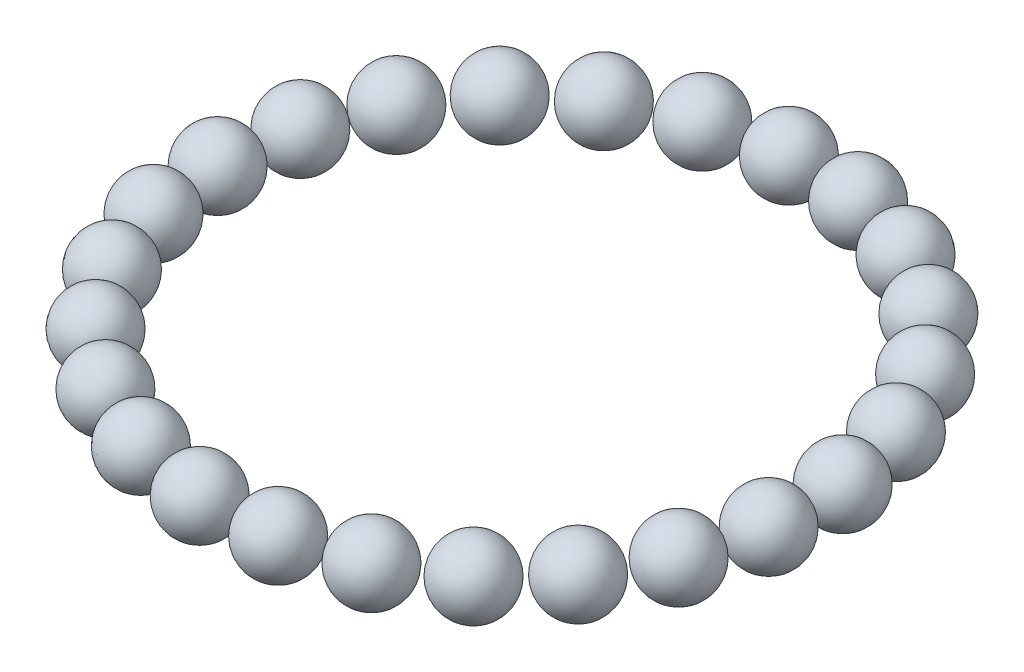
ISO-10303-21;
HEADER;
FILE_DESCRIPTION(('STEP AP214'),'2;1');
FILE_NAME('part.step','',(''),(''),'','','');
FILE_SCHEMA(('AUTOMOTIVE_DESIGN { 1 0 10303 214 1 1 1 1 }'));
ENDSEC;
DATA;
#1=APPLICATION_CONTEXT('core data for automotive mechanical design processes');
#2=APPLICATION_PROTOCOL_DEFINITION('international standard','automotive_design',2000,#1);
#3=PRODUCT_CONTEXT('',#1,'mechanical');
#4=PRODUCT('Part','Part','',(#3));
#5=PRODUCT_RELATED_PRODUCT_CATEGORY('part','',(#4));
#6=PRODUCT_DEFINITION_FORMATION('','',#4);
#7=PRODUCT_DEFINITION_CONTEXT('part definition',#1,'design');
#8=PRODUCT_DEFINITION('design','',#6,#7);
#9=PRODUCT_DEFINITION_SHAPE('','',#8);
#10=(LENGTH_UNIT() NAMED_UNIT(*) SI_UNIT(.MILLI.,.METRE.));
#11=(NAMED_UNIT(*) PLANE_ANGLE_UNIT() SI_UNIT($,.RADIAN.));
#12=(NAMED_UNIT(*) SI_UNIT($,.STERADIAN.) SOLID_ANGLE_UNIT());
#13=UNCERTAINTY_MEASURE_WITH_UNIT(LENGTH_MEASURE(1.E-05),#10,'distance_accuracy_value','');
#14=(GEOMETRIC_REPRESENTATION_CONTEXT(3) GLOBAL_UNCERTAINTY_ASSIGNED_CONTEXT((#13)) GLOBAL_UNIT_ASSIGNED_CONTEXT((#10,
#11,#12)) REPRESENTATION_CONTEXT('',''));
#15=CARTESIAN_POINT('',(0.,0.,0.));
#16=DIRECTION('',(0.,0.,1.));
#17=DIRECTION('',(1.,0.,0.));
#18=AXIS2_PLACEMENT_3D('',#15,#16,#17);
#19=CARTESIAN_POINT('',(-29.2695194201453,0.,-16.091054468671));
#20=DIRECTION('',(0.,1.,0.));
#21=DIRECTION('',(-0.87630668004387,0.,-0.481753674101704));
#22=AXIS2_PLACEMENT_3D('',#19,#20,#21);
#23=SPHERICAL_SURFACE('',#22,3.96875);
#24=CARTESIAN_POINT('',(-29.2695194201453,3.96875,-16.091054468671));
#25=VERTEX_POINT('',#24);
#26=VERTEX_LOOP('',#25);
#27=FACE_BOUND('',#26,.T.);
#28=ADVANCED_FACE('P0_F13',(#27),#23,.T.);
#29=CLOSED_SHELL('',(#28));
#30=MANIFOLD_SOLID_BREP('P0_B1',#29);
#31=CARTESIAN_POINT('',(33.1376231386049,0.,4.1862553342811));
#32=DIRECTION('',(0.,1.,0.));
#33=DIRECTION('',(0.992114701314479,0.,0.125333233564297));
#34=AXIS2_PLACEMENT_3D('',#31,#32,#33);
#35=SPHERICAL_SURFACE('',#34,3.96875);
#36=CARTESIAN_POINT('',(33.1376231386049,3.96875,4.1862553342811));
#37=VERTEX_POINT('',#36);
#38=VERTEX_LOOP('',#37);
#39=FACE_BOUND('',#38,.T.);
#40=ADVANCED_FACE('P1_F13',(#39),#35,.T.);
#41=CLOSED_SHELL('',(#40));
#42=MANIFOLD_SOLID_BREP('P1_B1',#41);
#43=CARTESIAN_POINT('',(-33.401,0.,0.));
#44=DIRECTION('',(0.,1.,0.));
#45=DIRECTION('',(-1.,0.,0.));
#46=AXIS2_PLACEMENT_3D('',#43,#44,#45);
#47=SPHERICAL_SURFACE('',#46,3.96875);
#48=CARTESIAN_POINT('',(-33.401,3.96875,0.));
#49=VERTEX_POINT('',#48);
#50=VERTEX_LOOP('',#49);
#51=FACE_BOUND('',#50,.T.);
#52=ADVANCED_FACE('P2_F13',(#51),#47,.T.);
#53=CLOSED_SHELL('',(#52));
#54=MANIFOLD_SOLID_BREP('P2_B1',#53);
#55=CARTESIAN_POINT('',(-32.3516461648575,0.,-8.30649092119287));
#56=DIRECTION('',(0.,1.,0.));
#57=DIRECTION('',(-0.968583161128635,0.,-0.248689887164842));
#58=AXIS2_PLACEMENT_3D('',#55,#56,#57);
#59=SPHERICAL_SURFACE('',#58,3.96875);
#60=CARTESIAN_POINT('',(-32.3516461648575,3.96875,-8.30649092119287));
#61=VERTEX_POINT('',#60);
#62=VERTEX_LOOP('',#61);
#63=FACE_BOUND('',#62,.T.);
#64=ADVANCED_FACE('P3_F13',(#63),#59,.T.);
#65=CLOSED_SHELL('',(#64));
#66=MANIFOLD_SOLID_BREP('P3_B1',#65);
#67=CARTESIAN_POINT('',(33.1376231386048,0.,-4.18625533428156));
#68=DIRECTION('',(0.,1.,0.));
#69=DIRECTION('',(0.992114701314477,0.,-0.125333233564311));
#70=AXIS2_PLACEMENT_3D('',#67,#68,#69);
#71=SPHERICAL_SURFACE('',#70,3.96875);
#72=CARTESIAN_POINT('',(33.1376231386048,3.96875,-4.18625533428156));
#73=VERTEX_POINT('',#72);
#74=VERTEX_LOOP('',#73);
#75=FACE_BOUND('',#74,.T.);
#76=ADVANCED_FACE('P4_F13',(#75),#71,.T.);
#77=CLOSED_SHELL('',(#76));
#78=MANIFOLD_SOLID_BREP('P4_B1',#77);
#79=CARTESIAN_POINT('',(-32.3516461648574,0.,8.30649092119333));
#80=DIRECTION('',(0.,1.,0.));
#81=DIRECTION('',(-0.968583161128631,0.,0.248689887164855));
#82=AXIS2_PLACEMENT_3D('',#79,#80,#81);
#83=SPHERICAL_SURFACE('',#82,3.96875);
#84=CARTESIAN_POINT('',(-32.3516461648574,3.96875,8.30649092119333));
#85=VERTEX_POINT('',#84);
#86=VERTEX_LOOP('',#85);
#87=FACE_BOUND('',#86,.T.);
#88=ADVANCED_FACE('P5_F13',(#87),#83,.T.);
#89=CLOSED_SHELL('',(#88));
#90=MANIFOLD_SOLID_BREP('P5_B1',#89);
#91=CARTESIAN_POINT('',(31.0554644051534,0.,-12.2957281842212));
#92=DIRECTION('',(0.,1.,0.));
#93=DIRECTION('',(0.929776485888248,0.,-0.368124552684685));
#94=AXIS2_PLACEMENT_3D('',#91,#92,#93);
#95=SPHERICAL_SURFACE('',#94,3.96875);
#96=CARTESIAN_POINT('',(31.0554644051534,3.96875,-12.2957281842212));
#97=VERTEX_POINT('',#96);
#98=VERTEX_LOOP('',#97);
#99=FACE_BOUND('',#98,.T.);
#100=ADVANCED_FACE('P6_F13',(#99),#95,.T.);
#101=CLOSED_SHELL('',(#100));
#102=MANIFOLD_SOLID_BREP('P6_B1',#101);
#103=CARTESIAN_POINT('',(-29.2695194201451,0.,16.0910544686714));
#104=DIRECTION('',(0.,1.,0.));
#105=DIRECTION('',(-0.876306680043863,0.,0.481753674101716));
#106=AXIS2_PLACEMENT_3D('',#103,#104,#105);
#107=SPHERICAL_SURFACE('',#106,3.96875);
#108=CARTESIAN_POINT('',(-29.2695194201451,3.96875,16.0910544686714));
#109=VERTEX_POINT('',#108);
#110=VERTEX_LOOP('',#109);
#111=FACE_BOUND('',#110,.T.);
#112=ADVANCED_FACE('P7_F13',(#111),#107,.T.);
#113=CLOSED_SHELL('',(#112));
#114=MANIFOLD_SOLID_BREP('P7_B1',#113);
#115=CARTESIAN_POINT('',(27.0219766291174,0.,-19.6326152118211));
#116=DIRECTION('',(0.,1.,0.));
#117=DIRECTION('',(0.809016994374942,0.,-0.58778525229248));
#118=AXIS2_PLACEMENT_3D('',#115,#116,#117);
#119=SPHERICAL_SURFACE('',#118,3.96875);
#120=CARTESIAN_POINT('',(27.0219766291174,3.96875,-19.6326152118211));
#121=VERTEX_POINT('',#120);
#122=VERTEX_LOOP('',#121);
#123=FACE_BOUND('',#122,.T.);
#124=ADVANCED_FACE('P8_F13',(#123),#119,.T.);
#125=CLOSED_SHELL('',(#124));
#126=MANIFOLD_SOLID_BREP('P8_B1',#125);
#127=CARTESIAN_POINT('',(-24.3482811245025,0.,22.8645578851242));
#128=DIRECTION('',(0.,1.,0.));
#129=DIRECTION('',(-0.72896862742141,0.,0.68454710592869));
#130=AXIS2_PLACEMENT_3D('',#127,#128,#129);
#131=SPHERICAL_SURFACE('',#130,3.96875);
#132=CARTESIAN_POINT('',(-24.3482811245025,3.96875,22.8645578851242));
#133=VERTEX_POINT('',#132);
#134=VERTEX_LOOP('',#133);
#135=FACE_BOUND('',#134,.T.);
#136=ADVANCED_FACE('P9_F13',(#135),#131,.T.);
#137=CLOSED_SHELL('',(#136));
#138=MANIFOLD_SOLID_BREP('P9_B1',#137);
#139=CARTESIAN_POINT('',(21.2905986815957,0.,-25.7359128219543));
#140=DIRECTION('',(0.,1.,0.));
#141=DIRECTION('',(0.637423989748683,0.,-0.770513242775795));
#142=AXIS2_PLACEMENT_3D('',#139,#140,#141);
#143=SPHERICAL_SURFACE('',#142,3.96875);
#144=CARTESIAN_POINT('',(21.2905986815957,3.96875,-25.7359128219543));
#145=VERTEX_POINT('',#144);
#146=VERTEX_LOOP('',#145);
#147=FACE_BOUND('',#146,.T.);
#148=ADVANCED_FACE('P10_F13',(#147),#143,.T.);
#149=CLOSED_SHELL('',(#148));
#150=MANIFOLD_SOLID_BREP('P10_B1',#149);
#151=CARTESIAN_POINT('',(-17.8971507790934,0.,28.2013970396928));
#152=DIRECTION('',(0.,1.,0.));
#153=DIRECTION('',(-0.535826794978995,0.,0.844327925502017));
#154=AXIS2_PLACEMENT_3D('',#151,#152,#153);
#155=SPHERICAL_SURFACE('',#154,3.96875);
#156=CARTESIAN_POINT('',(-17.8971507790934,3.96875,28.2013970396928));
#157=VERTEX_POINT('',#156);
#158=VERTEX_LOOP('',#157);
#159=FACE_BOUND('',#158,.T.);
#160=ADVANCED_FACE('P11_F13',(#159),#155,.T.);
#161=CLOSED_SHELL('',(#160));
#162=MANIFOLD_SOLID_BREP('P11_B1',#161);
#163=CARTESIAN_POINT('',(14.2214541175647,0.,-30.2221283794176));
#164=DIRECTION('',(0.,1.,0.));
#165=DIRECTION('',(0.425779291565064,0.,-0.904827052466024));
#166=AXIS2_PLACEMENT_3D('',#163,#164,#165);
#167=SPHERICAL_SURFACE('',#166,3.96875);
#168=CARTESIAN_POINT('',(14.2214541175647,3.96875,-30.2221283794176));
#169=VERTEX_POINT('',#168);
#170=VERTEX_LOOP('',#169);
#171=FACE_BOUND('',#170,.T.);
#172=ADVANCED_FACE('P12_F13',(#171),#167,.T.);
#173=CLOSED_SHELL('',(#172));
#174=MANIFOLD_SOLID_BREP('P12_B1',#173);
#175=CARTESIAN_POINT('',(-10.3214766291175,0.,31.7662387007745));
#176=DIRECTION('',(0.,1.,0.));
#177=DIRECTION('',(-0.309016994374945,0.,0.951056516295155));
#178=AXIS2_PLACEMENT_3D('',#175,#176,#177);
#179=SPHERICAL_SURFACE('',#178,3.96875);
#180=CARTESIAN_POINT('',(-10.3214766291175,3.96875,31.7662387007745));
#181=VERTEX_POINT('',#180);
#182=VERTEX_LOOP('',#181);
#183=FACE_BOUND('',#182,.T.);
#184=ADVANCED_FACE('P13_F13',(#183),#179,.T.);
#185=CLOSED_SHELL('',(#184));
#186=MANIFOLD_SOLID_BREP('P13_B1',#185);
#187=CARTESIAN_POINT('',(6.25872328847747,0.,-32.809376461589));
#188=DIRECTION('',(0.,1.,0.));
#189=DIRECTION('',(0.187381314585715,0.,-0.982287250728691));
#190=AXIS2_PLACEMENT_3D('',#187,#188,#189);
#191=SPHERICAL_SURFACE('',#190,3.96875);
#192=CARTESIAN_POINT('',(6.25872328847747,3.96875,-32.809376461589));
#193=VERTEX_POINT('',#192);
#194=VERTEX_LOOP('',#193);
#195=FACE_BOUND('',#194,.T.);
#196=ADVANCED_FACE('P14_F13',(#195),#191,.T.);
#197=CLOSED_SHELL('',(#196));
#198=MANIFOLD_SOLID_BREP('P14_B1',#197);
#199=CARTESIAN_POINT('',(-2.09726614279848,0.,33.3350907562327));
#200=DIRECTION('',(0.,1.,0.));
#201=DIRECTION('',(-0.06279051952931,0.,0.998026728428272));
#202=AXIS2_PLACEMENT_3D('',#199,#200,#201);
#203=SPHERICAL_SURFACE('',#202,3.96875);
#204=CARTESIAN_POINT('',(-2.09726614279848,3.96875,33.3350907562327));
#205=VERTEX_POINT('',#204);
#206=VERTEX_LOOP('',#205);
#207=FACE_BOUND('',#206,.T.);
#208=ADVANCED_FACE('P15_F13',(#207),#203,.T.);
#209=CLOSED_SHELL('',(#208));
#210=MANIFOLD_SOLID_BREP('P15_B1',#209);
#211=CARTESIAN_POINT('',(6.25872328847792,0.,32.8093764615889));
#212=DIRECTION('',(0.,1.,0.));
#213=DIRECTION('',(0.187381314585729,0.,0.982287250728688));
#214=AXIS2_PLACEMENT_3D('',#211,#212,#213);
#215=SPHERICAL_SURFACE('',#214,3.96875);
#216=CARTESIAN_POINT('',(6.25872328847792,3.96875,32.8093764615889));
#217=VERTEX_POINT('',#216);
#218=VERTEX_LOOP('',#217);
#219=FACE_BOUND('',#218,.T.);
#220=ADVANCED_FACE('P16_F13',(#219),#215,.T.);
#221=CLOSED_SHELL('',(#220));
#222=MANIFOLD_SOLID_BREP('P16_B1',#221);
#223=CARTESIAN_POINT('',(14.2214541175651,0.,30.2221283794174));
#224=DIRECTION('',(0.,1.,0.));
#225=DIRECTION('',(0.425779291565077,0.,0.904827052466018));
#226=AXIS2_PLACEMENT_3D('',#223,#224,#225);
#227=SPHERICAL_SURFACE('',#226,3.96875);
#228=CARTESIAN_POINT('',(14.2214541175651,3.96875,30.2221283794174));
#229=VERTEX_POINT('',#228);
#230=VERTEX_LOOP('',#229);
#231=FACE_BOUND('',#230,.T.);
#232=ADVANCED_FACE('P17_F13',(#231),#227,.T.);
#233=CLOSED_SHELL('',(#232));
#234=MANIFOLD_SOLID_BREP('P17_B1',#233);
#235=CARTESIAN_POINT('',(-2.09726614279896,0.,-33.3350907562327));
#236=DIRECTION('',(0.,1.,0.));
#237=DIRECTION('',(-0.0627905195293244,0.,-0.998026728428271));
#238=AXIS2_PLACEMENT_3D('',#235,#236,#237);
#239=SPHERICAL_SURFACE('',#238,3.96875);
#240=CARTESIAN_POINT('',(-2.09726614279896,3.96875,-33.3350907562327));
#241=VERTEX_POINT('',#240);
#242=VERTEX_LOOP('',#241);
#243=FACE_BOUND('',#242,.T.);
#244=ADVANCED_FACE('P18_F13',(#243),#239,.T.);
#245=CLOSED_SHELL('',(#244));
#246=MANIFOLD_SOLID_BREP('P18_B1',#245);
#247=CARTESIAN_POINT('',(-10.321476629118,0.,-31.7662387007743));
#248=DIRECTION('',(0.,1.,0.));
#249=DIRECTION('',(-0.309016994374958,0.,-0.95105651629515));
#250=AXIS2_PLACEMENT_3D('',#247,#248,#249);
#251=SPHERICAL_SURFACE('',#250,3.96875);
#252=CARTESIAN_POINT('',(-10.321476629118,3.96875,-31.7662387007743));
#253=VERTEX_POINT('',#252);
#254=VERTEX_LOOP('',#253);
#255=FACE_BOUND('',#254,.T.);
#256=ADVANCED_FACE('P19_F13',(#255),#251,.T.);
#257=CLOSED_SHELL('',(#256));
#258=MANIFOLD_SOLID_BREP('P19_B1',#257);
#259=CARTESIAN_POINT('',(21.2905986815961,0.,25.735912821954));
#260=DIRECTION('',(0.,1.,0.));
#261=DIRECTION('',(0.637423989748694,0.,0.770513242775786));
#262=AXIS2_PLACEMENT_3D('',#259,#260,#261);
#263=SPHERICAL_SURFACE('',#262,3.96875);
#264=CARTESIAN_POINT('',(21.2905986815961,3.96875,25.735912821954));
#265=VERTEX_POINT('',#264);
#266=VERTEX_LOOP('',#265);
#267=FACE_BOUND('',#266,.T.);
#268=ADVANCED_FACE('P20_F13',(#267),#263,.T.);
#269=CLOSED_SHELL('',(#268));
#270=MANIFOLD_SOLID_BREP('P20_B1',#269);
#271=CARTESIAN_POINT('',(-17.8971507790938,0.,-28.2013970396926));
#272=DIRECTION('',(0.,1.,0.));
#273=DIRECTION('',(-0.535826794979007,0.,-0.844327925502009));
#274=AXIS2_PLACEMENT_3D('',#271,#272,#273);
#275=SPHERICAL_SURFACE('',#274,3.96875);
#276=CARTESIAN_POINT('',(-17.8971507790938,3.96875,-28.2013970396926));
#277=VERTEX_POINT('',#276);
#278=VERTEX_LOOP('',#277);
#279=FACE_BOUND('',#278,.T.);
#280=ADVANCED_FACE('P21_F13',(#279),#275,.T.);
#281=CLOSED_SHELL('',(#280));
#282=MANIFOLD_SOLID_BREP('P21_B1',#281);
#283=CARTESIAN_POINT('',(27.0219766291177,0.,19.6326152118207));
#284=DIRECTION('',(0.,1.,0.));
#285=DIRECTION('',(0.809016994374951,0.,0.587785252292469));
#286=AXIS2_PLACEMENT_3D('',#283,#284,#285);
#287=SPHERICAL_SURFACE('',#286,3.96875);
#288=CARTESIAN_POINT('',(27.0219766291177,3.96875,19.6326152118207));
#289=VERTEX_POINT('',#288);
#290=VERTEX_LOOP('',#289);
#291=FACE_BOUND('',#290,.T.);
#292=ADVANCED_FACE('P22_F13',(#291),#287,.T.);
#293=CLOSED_SHELL('',(#292));
#294=MANIFOLD_SOLID_BREP('P22_B1',#293);
#295=CARTESIAN_POINT('',(-24.3482811245029,0.,-22.8645578851238));
#296=DIRECTION('',(0.,1.,0.));
#297=DIRECTION('',(-0.72896862742142,0.,-0.684547105928679));
#298=AXIS2_PLACEMENT_3D('',#295,#296,#297);
#299=SPHERICAL_SURFACE('',#298,3.96875);
#300=CARTESIAN_POINT('',(-24.3482811245029,3.96875,-22.8645578851238));
#301=VERTEX_POINT('',#300);
#302=VERTEX_LOOP('',#301);
#303=FACE_BOUND('',#302,.T.);
#304=ADVANCED_FACE('P23_F13',(#303),#299,.T.);
#305=CLOSED_SHELL('',(#304));
#306=MANIFOLD_SOLID_BREP('P23_B1',#305);
#307=CARTESIAN_POINT('',(31.0554644051536,0.,12.2957281842207));
#308=DIRECTION('',(0.,1.,0.));
#309=DIRECTION('',(0.929776485888254,0.,0.368124552684672));
#310=AXIS2_PLACEMENT_3D('',#307,#308,#309);
#311=SPHERICAL_SURFACE('',#310,3.96875);
#312=CARTESIAN_POINT('',(31.0554644051536,3.96875,12.2957281842207));
#313=VERTEX_POINT('',#312);
#314=VERTEX_LOOP('',#313);
#315=FACE_BOUND('',#314,.T.);
#316=ADVANCED_FACE('P24_F13',(#315),#311,.T.);
#317=CLOSED_SHELL('',(#316));
#318=MANIFOLD_SOLID_BREP('P24_B1',#317);
#319=ADVANCED_BREP_SHAPE_REPRESENTATION('',(#18,#30,#42,#54,#66,#78,#90,#102,#114,#126,#138,
#150,#162,#174,#186,#198,#210,#222,#234,#246,#258,#270,#282,#294,#306,#318),#14);
#320=SHAPE_DEFINITION_REPRESENTATION(#9,#319);
ENDSEC;
END-ISO-10303-21;
